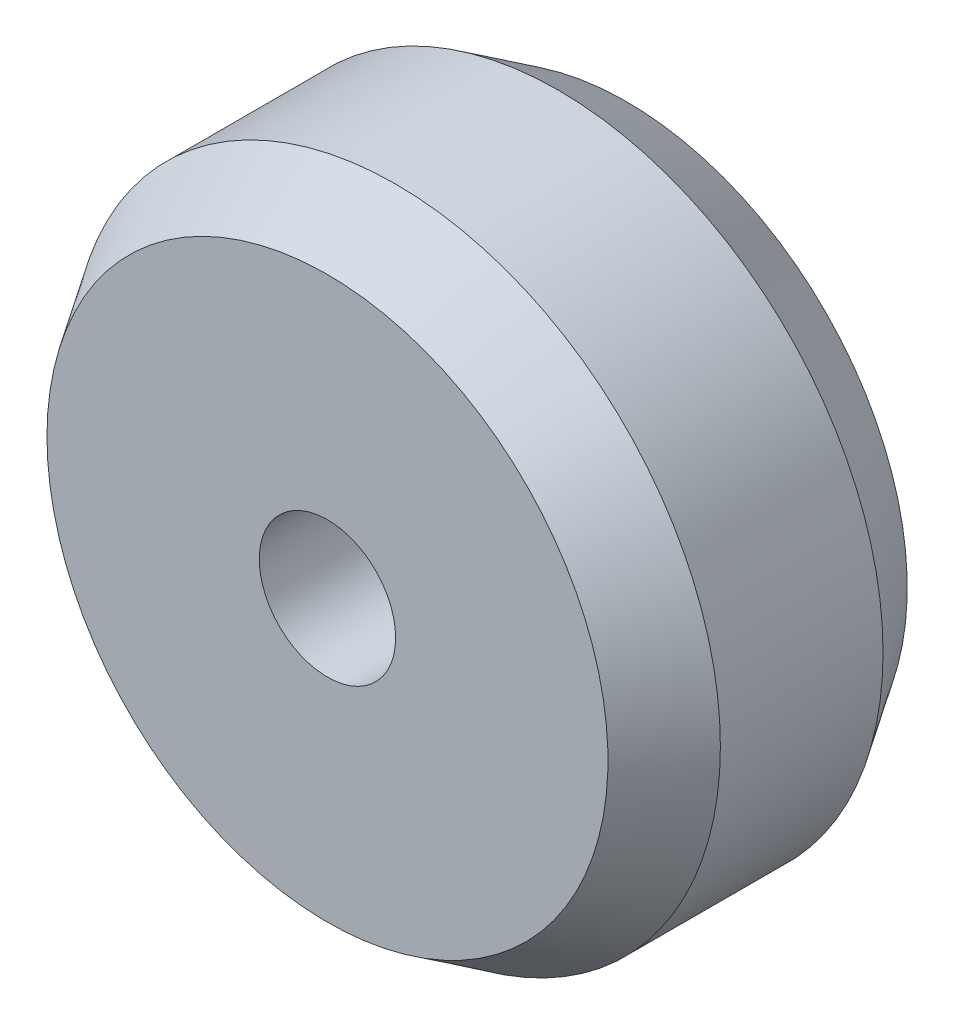
ISO-10303-21;
HEADER;
FILE_DESCRIPTION(('STEP AP214'),'2;1');
FILE_NAME('part.step','',(''),(''),'','','');
FILE_SCHEMA(('AUTOMOTIVE_DESIGN { 1 0 10303 214 1 1 1 1 }'));
ENDSEC;
DATA;
#1=APPLICATION_CONTEXT('core data for automotive mechanical design processes');
#2=APPLICATION_PROTOCOL_DEFINITION('international standard','automotive_design',2000,#1);
#3=PRODUCT_CONTEXT('',#1,'mechanical');
#4=PRODUCT('Part','Part','',(#3));
#5=PRODUCT_RELATED_PRODUCT_CATEGORY('part','',(#4));
#6=PRODUCT_DEFINITION_FORMATION('','',#4);
#7=PRODUCT_DEFINITION_CONTEXT('part definition',#1,'design');
#8=PRODUCT_DEFINITION('design','',#6,#7);
#9=PRODUCT_DEFINITION_SHAPE('','',#8);
#10=(LENGTH_UNIT() NAMED_UNIT(*) SI_UNIT(.MILLI.,.METRE.));
#11=(NAMED_UNIT(*) PLANE_ANGLE_UNIT() SI_UNIT($,.RADIAN.));
#12=(NAMED_UNIT(*) SI_UNIT($,.STERADIAN.) SOLID_ANGLE_UNIT());
#13=UNCERTAINTY_MEASURE_WITH_UNIT(LENGTH_MEASURE(1.E-05),#10,'distance_accuracy_value','');
#14=(GEOMETRIC_REPRESENTATION_CONTEXT(3) GLOBAL_UNCERTAINTY_ASSIGNED_CONTEXT((#13)) GLOBAL_UNIT_ASSIGNED_CONTEXT((#10,
#11,#12)) REPRESENTATION_CONTEXT('',''));
#15=CARTESIAN_POINT('',(0.,0.,0.));
#16=DIRECTION('',(0.,0.,1.));
#17=DIRECTION('',(1.,0.,0.));
#18=AXIS2_PLACEMENT_3D('',#15,#16,#17);
#19=CARTESIAN_POINT('',(0.,0.,11.04));
#20=DIRECTION('',(0.,0.,1.));
#21=DIRECTION('',(1.,0.,0.));
#22=AXIS2_PLACEMENT_3D('',#19,#20,#21);
#23=PLANE('',#22);
#24=CARTESIAN_POINT('',(0.,0.,11.04));
#25=DIRECTION('',(0.,0.,-1.));
#26=DIRECTION('',(-1.,0.,0.));
#27=AXIS2_PLACEMENT_3D('',#24,#25,#26);
#28=CIRCLE('',#27,10.3472408040499);
#29=CARTESIAN_POINT('',(-10.3472408040499,0.,11.04));
#30=VERTEX_POINT('',#29);
#31=EDGE_CURVE('E45',#30,#30,#28,.T.);
#32=ORIENTED_EDGE('',*,*,#31,.F.);
#33=EDGE_LOOP('',(#32));
#34=FACE_BOUND('',#33,.T.);
#35=CARTESIAN_POINT('',(0.,0.,11.04));
#36=DIRECTION('',(0.,0.,1.));
#37=DIRECTION('',(1.,0.,0.));
#38=AXIS2_PLACEMENT_3D('',#35,#36,#37);
#39=CIRCLE('',#38,2.515);
#40=CARTESIAN_POINT('',(2.515,0.,11.04));
#41=VERTEX_POINT('',#40);
#42=EDGE_CURVE('E10',#41,#41,#39,.T.);
#43=ORIENTED_EDGE('',*,*,#42,.F.);
#44=EDGE_LOOP('',(#43));
#45=FACE_BOUND('',#44,.T.);
#46=ADVANCED_FACE('F34',(#34,#45),#23,.T.);
#47=CARTESIAN_POINT('',(0.,0.,0.));
#48=DIRECTION('',(0.,0.,1.));
#49=DIRECTION('',(1.,0.,0.));
#50=AXIS2_PLACEMENT_3D('',#47,#48,#49);
#51=PLANE('',#50);
#52=CARTESIAN_POINT('',(0.,0.,0.));
#53=DIRECTION('',(0.,0.,-1.));
#54=DIRECTION('',(-1.,0.,0.));
#55=AXIS2_PLACEMENT_3D('',#52,#53,#54);
#56=CIRCLE('',#55,10.3472408040499);
#57=CARTESIAN_POINT('',(-10.3472408040499,0.,0.));
#58=VERTEX_POINT('',#57);
#59=EDGE_CURVE('E55',#58,#58,#56,.T.);
#60=ORIENTED_EDGE('',*,*,#59,.T.);
#61=EDGE_LOOP('',(#60));
#62=FACE_BOUND('',#61,.T.);
#63=CARTESIAN_POINT('',(0.,0.,0.));
#64=DIRECTION('',(0.,0.,1.));
#65=DIRECTION('',(1.,0.,0.));
#66=AXIS2_PLACEMENT_3D('',#63,#64,#65);
#67=CIRCLE('',#66,2.515);
#68=CARTESIAN_POINT('',(2.515,0.,0.));
#69=VERTEX_POINT('',#68);
#70=EDGE_CURVE('E38',#69,#69,#67,.T.);
#71=ORIENTED_EDGE('',*,*,#70,.T.);
#72=EDGE_LOOP('',(#71));
#73=FACE_BOUND('',#72,.T.);
#74=ADVANCED_FACE('F59',(#62,#73),#51,.F.);
#75=CARTESIAN_POINT('',(0.,0.,11.04));
#76=DIRECTION('',(0.,0.,-1.));
#77=DIRECTION('',(-1.,0.,0.));
#78=AXIS2_PLACEMENT_3D('',#75,#76,#77);
#79=CYLINDRICAL_SURFACE('',#78,2.515);
#80=ORIENTED_EDGE('',*,*,#42,.T.);
#81=EDGE_LOOP('',(#80));
#82=FACE_BOUND('',#81,.T.);
#83=ORIENTED_EDGE('',*,*,#70,.F.);
#84=EDGE_LOOP('',(#83));
#85=FACE_BOUND('',#84,.T.);
#86=ADVANCED_FACE('F66',(#82,#85),#79,.F.);
#87=CARTESIAN_POINT('',(0.,0.,2.52));
#88=DIRECTION('',(0.,0.,1.));
#89=DIRECTION('',(1.,0.,0.));
#90=AXIS2_PLACEMENT_3D('',#87,#88,#89);
#91=CONICAL_SURFACE('',#90,11.975,0.573513104423097);
#92=ORIENTED_EDGE('',*,*,#59,.F.);
#93=EDGE_LOOP('',(#92));
#94=FACE_BOUND('',#93,.T.);
#95=CARTESIAN_POINT('',(0.,0.,2.52));
#96=DIRECTION('',(0.,0.,-1.));
#97=DIRECTION('',(-1.,0.,0.));
#98=AXIS2_PLACEMENT_3D('',#95,#96,#97);
#99=CIRCLE('',#98,11.975);
#100=CARTESIAN_POINT('',(-11.975,0.,2.52));
#101=VERTEX_POINT('',#100);
#102=EDGE_CURVE('E52',#101,#101,#99,.T.);
#103=ORIENTED_EDGE('',*,*,#102,.T.);
#104=EDGE_LOOP('',(#103));
#105=FACE_BOUND('',#104,.T.);
#106=ADVANCED_FACE('F62',(#94,#105),#91,.T.);
#107=CARTESIAN_POINT('',(0.,0.,11.04));
#108=DIRECTION('',(0.,0.,-1.));
#109=DIRECTION('',(-1.,0.,0.));
#110=AXIS2_PLACEMENT_3D('',#107,#108,#109);
#111=CONICAL_SURFACE('',#110,10.3472408040499,0.573513104423097);
#112=CARTESIAN_POINT('',(0.,0.,8.52));
#113=DIRECTION('',(0.,0.,-1.));
#114=DIRECTION('',(-1.,0.,0.));
#115=AXIS2_PLACEMENT_3D('',#112,#113,#114);
#116=CIRCLE('',#115,11.975);
#117=CARTESIAN_POINT('',(-11.975,0.,8.52));
#118=VERTEX_POINT('',#117);
#119=EDGE_CURVE('E49',#118,#118,#116,.T.);
#120=ORIENTED_EDGE('',*,*,#119,.F.);
#121=EDGE_LOOP('',(#120));
#122=FACE_BOUND('',#121,.T.);
#123=ORIENTED_EDGE('',*,*,#31,.T.);
#124=EDGE_LOOP('',(#123));
#125=FACE_BOUND('',#124,.T.);
#126=ADVANCED_FACE('F65',(#122,#125),#111,.T.);
#127=CARTESIAN_POINT('',(0.,0.,11.04));
#128=DIRECTION('',(0.,0.,-1.));
#129=DIRECTION('',(-1.,0.,0.));
#130=AXIS2_PLACEMENT_3D('',#127,#128,#129);
#131=CYLINDRICAL_SURFACE('',#130,11.975);
#132=ORIENTED_EDGE('',*,*,#119,.T.);
#133=EDGE_LOOP('',(#132));
#134=FACE_BOUND('',#133,.T.);
#135=ORIENTED_EDGE('',*,*,#102,.F.);
#136=EDGE_LOOP('',(#135));
#137=FACE_BOUND('',#136,.T.);
#138=ADVANCED_FACE('F36',(#134,#137),#131,.T.);
#139=CLOSED_SHELL('',(#46,#74,#86,#106,#126,#138));
#140=MANIFOLD_SOLID_BREP('B2',#139);
#141=ADVANCED_BREP_SHAPE_REPRESENTATION('',(#18,#140),#14);
#142=SHAPE_DEFINITION_REPRESENTATION(#9,#141);
ENDSEC;
END-ISO-10303-21;
